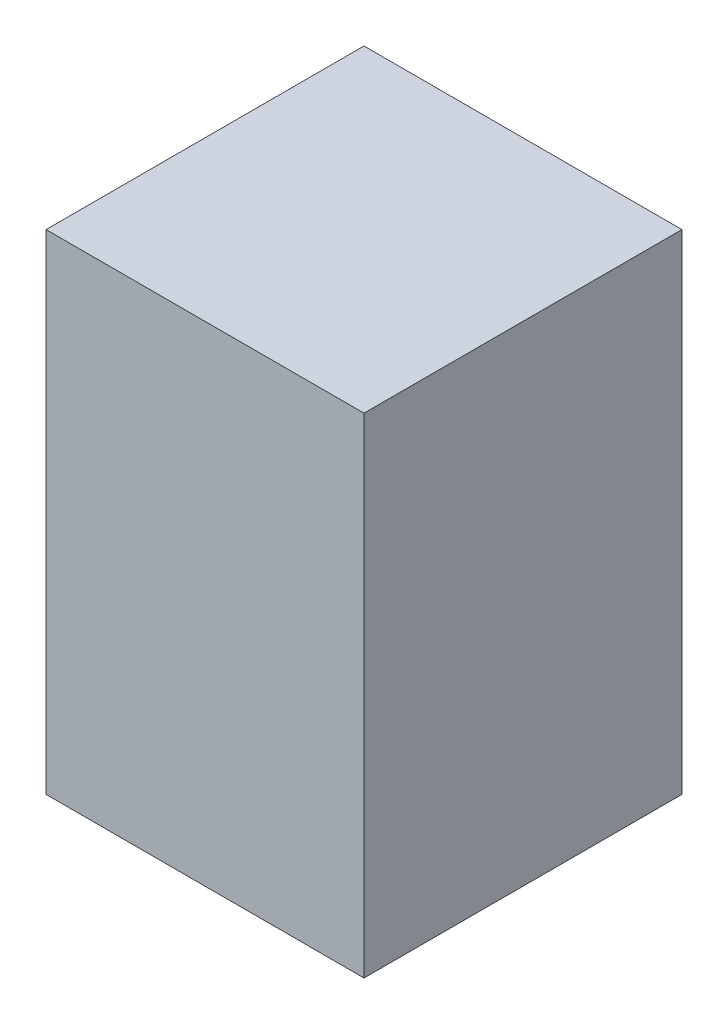
ISO-10303-21;
HEADER;
FILE_DESCRIPTION(('STEP AP214'),'2;1');
FILE_NAME('part.step','',(''),(''),'','','');
FILE_SCHEMA(('AUTOMOTIVE_DESIGN { 1 0 10303 214 1 1 1 1 }'));
ENDSEC;
DATA;
#1=APPLICATION_CONTEXT('core data for automotive mechanical design processes');
#2=APPLICATION_PROTOCOL_DEFINITION('international standard','automotive_design',2000,#1);
#3=PRODUCT_CONTEXT('',#1,'mechanical');
#4=PRODUCT('Part','Part','',(#3));
#5=PRODUCT_RELATED_PRODUCT_CATEGORY('part','',(#4));
#6=PRODUCT_DEFINITION_FORMATION('','',#4);
#7=PRODUCT_DEFINITION_CONTEXT('part definition',#1,'design');
#8=PRODUCT_DEFINITION('design','',#6,#7);
#9=PRODUCT_DEFINITION_SHAPE('','',#8);
#10=(LENGTH_UNIT() NAMED_UNIT(*) SI_UNIT(.MILLI.,.METRE.));
#11=(NAMED_UNIT(*) PLANE_ANGLE_UNIT() SI_UNIT($,.RADIAN.));
#12=(NAMED_UNIT(*) SI_UNIT($,.STERADIAN.) SOLID_ANGLE_UNIT());
#13=UNCERTAINTY_MEASURE_WITH_UNIT(LENGTH_MEASURE(1.E-05),#10,'distance_accuracy_value','');
#14=(GEOMETRIC_REPRESENTATION_CONTEXT(3) GLOBAL_UNCERTAINTY_ASSIGNED_CONTEXT((#13)) GLOBAL_UNIT_ASSIGNED_CONTEXT((#10,
#11,#12)) REPRESENTATION_CONTEXT('',''));
#15=CARTESIAN_POINT('',(0.,0.,0.));
#16=DIRECTION('',(0.,0.,1.));
#17=DIRECTION('',(1.,0.,0.));
#18=AXIS2_PLACEMENT_3D('',#15,#16,#17);
#19=CARTESIAN_POINT('',(0.,10.,0.));
#20=DIRECTION('',(1.,0.,0.));
#21=DIRECTION('',(0.,0.,-1.));
#22=AXIS2_PLACEMENT_3D('',#19,#20,#21);
#23=PLANE('',#22);
#24=DIRECTION('',(0.,0.,1.));
#25=VECTOR('',#24,1.);
#26=CARTESIAN_POINT('',(0.,0.,0.));
#27=LINE('',#26,#25);
#28=CARTESIAN_POINT('',(0.,0.,-6.5));
#29=VERTEX_POINT('',#28);
#30=CARTESIAN_POINT('',(0.,0.,0.));
#31=VERTEX_POINT('',#30);
#32=EDGE_CURVE('E96',#29,#31,#27,.T.);
#33=ORIENTED_EDGE('',*,*,#32,.T.);
#34=DIRECTION('',(0.,-1.,0.));
#35=VECTOR('',#34,1.);
#36=CARTESIAN_POINT('',(0.,10.,0.));
#37=LINE('',#36,#35);
#38=CARTESIAN_POINT('',(0.,10.,0.));
#39=VERTEX_POINT('',#38);
#40=EDGE_CURVE('E11',#39,#31,#37,.T.);
#41=ORIENTED_EDGE('',*,*,#40,.F.);
#42=DIRECTION('',(0.,0.,1.));
#43=VECTOR('',#42,1.);
#44=CARTESIAN_POINT('',(0.,10.,0.));
#45=LINE('',#44,#43);
#46=CARTESIAN_POINT('',(0.,10.,-6.5));
#47=VERTEX_POINT('',#46);
#48=EDGE_CURVE('E84',#47,#39,#45,.T.);
#49=ORIENTED_EDGE('',*,*,#48,.F.);
#50=DIRECTION('',(0.,-1.,0.));
#51=VECTOR('',#50,1.);
#52=CARTESIAN_POINT('',(0.,10.,-6.5));
#53=LINE('',#52,#51);
#54=EDGE_CURVE('E92',#47,#29,#53,.T.);
#55=ORIENTED_EDGE('',*,*,#54,.T.);
#56=EDGE_LOOP('',(#33,#41,#49,#55));
#57=FACE_BOUND('',#56,.T.);
#58=ADVANCED_FACE('F33',(#57),#23,.F.);
#59=CARTESIAN_POINT('',(0.,10.,0.));
#60=DIRECTION('',(0.,0.,-1.));
#61=DIRECTION('',(-1.,0.,0.));
#62=AXIS2_PLACEMENT_3D('',#59,#60,#61);
#63=PLANE('',#62);
#64=DIRECTION('',(1.,0.,0.));
#65=VECTOR('',#64,1.);
#66=CARTESIAN_POINT('',(0.,0.,0.));
#67=LINE('',#66,#65);
#68=CARTESIAN_POINT('',(6.5,0.,0.));
#69=VERTEX_POINT('',#68);
#70=EDGE_CURVE('E88',#31,#69,#67,.T.);
#71=ORIENTED_EDGE('',*,*,#70,.T.);
#72=DIRECTION('',(0.,-1.,0.));
#73=VECTOR('',#72,1.);
#74=CARTESIAN_POINT('',(6.5,10.,0.));
#75=LINE('',#74,#73);
#76=CARTESIAN_POINT('',(6.5,10.,0.));
#77=VERTEX_POINT('',#76);
#78=EDGE_CURVE('E41',#77,#69,#75,.T.);
#79=ORIENTED_EDGE('',*,*,#78,.F.);
#80=DIRECTION('',(1.,0.,0.));
#81=VECTOR('',#80,1.);
#82=CARTESIAN_POINT('',(0.,10.,0.));
#83=LINE('',#82,#81);
#84=EDGE_CURVE('E79',#39,#77,#83,.T.);
#85=ORIENTED_EDGE('',*,*,#84,.F.);
#86=ORIENTED_EDGE('',*,*,#40,.T.);
#87=EDGE_LOOP('',(#71,#79,#85,#86));
#88=FACE_BOUND('',#87,.T.);
#89=ADVANCED_FACE('F87',(#88),#63,.F.);
#90=CARTESIAN_POINT('',(6.5,10.,0.));
#91=DIRECTION('',(-1.,0.,0.));
#92=DIRECTION('',(0.,0.,1.));
#93=AXIS2_PLACEMENT_3D('',#90,#91,#92);
#94=PLANE('',#93);
#95=DIRECTION('',(0.,0.,-1.));
#96=VECTOR('',#95,1.);
#97=CARTESIAN_POINT('',(6.5,0.,0.));
#98=LINE('',#97,#96);
#99=CARTESIAN_POINT('',(6.5,0.,-6.5));
#100=VERTEX_POINT('',#99);
#101=EDGE_CURVE('E66',#69,#100,#98,.T.);
#102=ORIENTED_EDGE('',*,*,#101,.T.);
#103=DIRECTION('',(0.,-1.,0.));
#104=VECTOR('',#103,1.);
#105=CARTESIAN_POINT('',(6.5,10.,-6.5));
#106=LINE('',#105,#104);
#107=CARTESIAN_POINT('',(6.5,10.,-6.5));
#108=VERTEX_POINT('',#107);
#109=EDGE_CURVE('E89',#108,#100,#106,.T.);
#110=ORIENTED_EDGE('',*,*,#109,.F.);
#111=DIRECTION('',(0.,0.,-1.));
#112=VECTOR('',#111,1.);
#113=CARTESIAN_POINT('',(6.5,10.,0.));
#114=LINE('',#113,#112);
#115=EDGE_CURVE('E82',#77,#108,#114,.T.);
#116=ORIENTED_EDGE('',*,*,#115,.F.);
#117=ORIENTED_EDGE('',*,*,#78,.T.);
#118=EDGE_LOOP('',(#102,#110,#116,#117));
#119=FACE_BOUND('',#118,.T.);
#120=ADVANCED_FACE('F90',(#119),#94,.F.);
#121=CARTESIAN_POINT('',(0.,10.,-6.5));
#122=DIRECTION('',(0.,0.,1.));
#123=DIRECTION('',(1.,0.,0.));
#124=AXIS2_PLACEMENT_3D('',#121,#122,#123);
#125=PLANE('',#124);
#126=DIRECTION('',(-1.,0.,0.));
#127=VECTOR('',#126,1.);
#128=CARTESIAN_POINT('',(0.,0.,-6.5));
#129=LINE('',#128,#127);
#130=EDGE_CURVE('E72',#100,#29,#129,.T.);
#131=ORIENTED_EDGE('',*,*,#130,.T.);
#132=ORIENTED_EDGE('',*,*,#54,.F.);
#133=DIRECTION('',(-1.,0.,0.));
#134=VECTOR('',#133,1.);
#135=CARTESIAN_POINT('',(0.,10.,-6.5));
#136=LINE('',#135,#134);
#137=EDGE_CURVE('E49',#108,#47,#136,.T.);
#138=ORIENTED_EDGE('',*,*,#137,.F.);
#139=ORIENTED_EDGE('',*,*,#109,.T.);
#140=EDGE_LOOP('',(#131,#132,#138,#139));
#141=FACE_BOUND('',#140,.T.);
#142=ADVANCED_FACE('F103',(#141),#125,.F.);
#143=CARTESIAN_POINT('',(0.,10.,-6.5));
#144=DIRECTION('',(0.,-1.,0.));
#145=DIRECTION('',(0.,0.,-1.));
#146=AXIS2_PLACEMENT_3D('',#143,#144,#145);
#147=PLANE('',#146);
#148=ORIENTED_EDGE('',*,*,#48,.T.);
#149=ORIENTED_EDGE('',*,*,#84,.T.);
#150=ORIENTED_EDGE('',*,*,#115,.T.);
#151=ORIENTED_EDGE('',*,*,#137,.T.);
#152=EDGE_LOOP('',(#148,#149,#150,#151));
#153=FACE_BOUND('',#152,.T.);
#154=ADVANCED_FACE('F80',(#153),#147,.F.);
#155=CARTESIAN_POINT('',(0.,0.,-6.5));
#156=DIRECTION('',(0.,-1.,0.));
#157=DIRECTION('',(0.,0.,-1.));
#158=AXIS2_PLACEMENT_3D('',#155,#156,#157);
#159=PLANE('',#158);
#160=ORIENTED_EDGE('',*,*,#32,.F.);
#161=ORIENTED_EDGE('',*,*,#130,.F.);
#162=ORIENTED_EDGE('',*,*,#101,.F.);
#163=ORIENTED_EDGE('',*,*,#70,.F.);
#164=EDGE_LOOP('',(#160,#161,#162,#163));
#165=FACE_BOUND('',#164,.T.);
#166=ADVANCED_FACE('F106',(#165),#159,.T.);
#167=CLOSED_SHELL('',(#58,#89,#120,#142,#154,#166));
#168=MANIFOLD_SOLID_BREP('B2',#167);
#169=ADVANCED_BREP_SHAPE_REPRESENTATION('',(#18,#168),#14);
#170=SHAPE_DEFINITION_REPRESENTATION(#9,#169);
ENDSEC;
END-ISO-10303-21;
